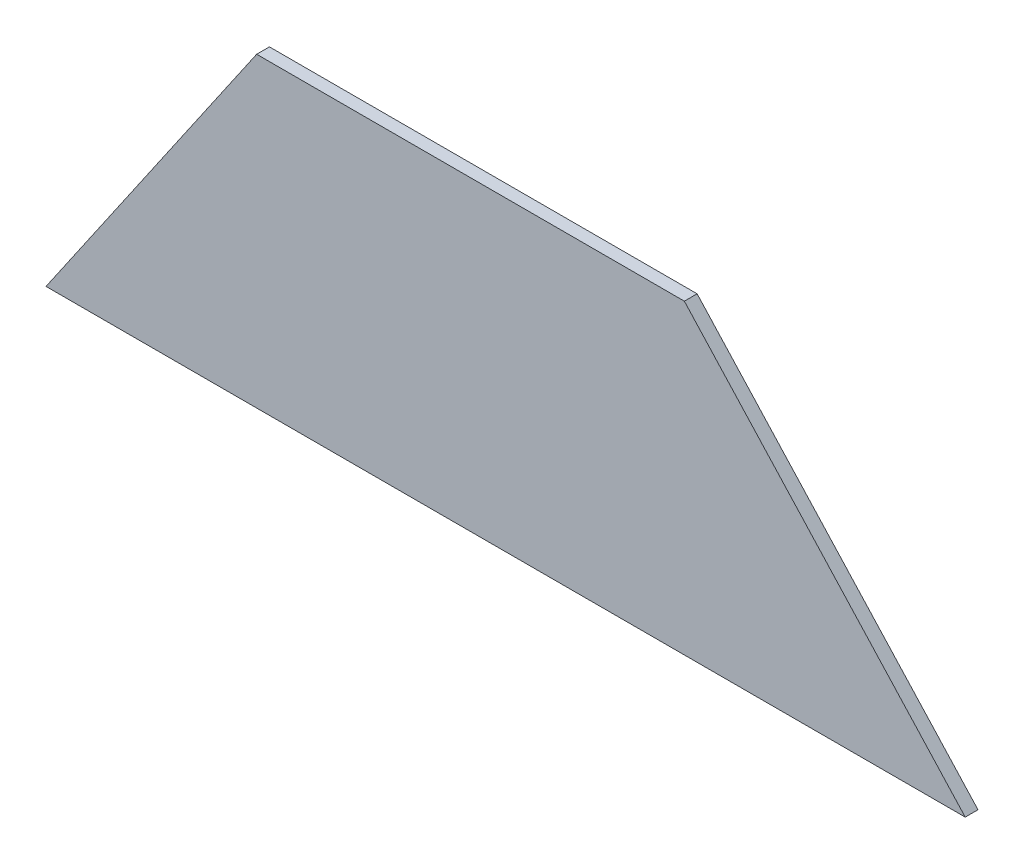
ISO-10303-21;
HEADER;
FILE_DESCRIPTION(('STEP AP214'),'2;1');
FILE_NAME('part.step','',(''),(''),'','','');
FILE_SCHEMA(('AUTOMOTIVE_DESIGN { 1 0 10303 214 1 1 1 1 }'));
ENDSEC;
DATA;
#1=APPLICATION_CONTEXT('core data for automotive mechanical design processes');
#2=APPLICATION_PROTOCOL_DEFINITION('international standard','automotive_design',2000,#1);
#3=PRODUCT_CONTEXT('',#1,'mechanical');
#4=PRODUCT('Part','Part','',(#3));
#5=PRODUCT_RELATED_PRODUCT_CATEGORY('part','',(#4));
#6=PRODUCT_DEFINITION_FORMATION('','',#4);
#7=PRODUCT_DEFINITION_CONTEXT('part definition',#1,'design');
#8=PRODUCT_DEFINITION('design','',#6,#7);
#9=PRODUCT_DEFINITION_SHAPE('','',#8);
#10=(LENGTH_UNIT() NAMED_UNIT(*) SI_UNIT(.MILLI.,.METRE.));
#11=(NAMED_UNIT(*) PLANE_ANGLE_UNIT() SI_UNIT($,.RADIAN.));
#12=(NAMED_UNIT(*) SI_UNIT($,.STERADIAN.) SOLID_ANGLE_UNIT());
#13=UNCERTAINTY_MEASURE_WITH_UNIT(LENGTH_MEASURE(1.E-05),#10,'distance_accuracy_value','');
#14=(GEOMETRIC_REPRESENTATION_CONTEXT(3) GLOBAL_UNCERTAINTY_ASSIGNED_CONTEXT((#13)) GLOBAL_UNIT_ASSIGNED_CONTEXT((#10,
#11,#12)) REPRESENTATION_CONTEXT('',''));
#15=CARTESIAN_POINT('',(0.,0.,0.));
#16=DIRECTION('',(0.,0.,1.));
#17=DIRECTION('',(1.,0.,0.));
#18=AXIS2_PLACEMENT_3D('',#15,#16,#17);
#19=CARTESIAN_POINT('',(26.19375,38.1,1.5875));
#20=DIRECTION('',(0.824041924199368,-0.566528822887065,0.));
#21=DIRECTION('',(0.566528822887065,0.824041924199368,0.));
#22=AXIS2_PLACEMENT_3D('',#19,#20,#21);
#23=PLANE('',#22);
#24=DIRECTION('',(-0.566528822887065,-0.824041924199368,0.));
#25=VECTOR('',#24,1.);
#26=CARTESIAN_POINT('',(26.19375,38.1,0.));
#27=LINE('',#26,#25);
#28=CARTESIAN_POINT('',(26.19375,38.1,0.));
#29=VERTEX_POINT('',#28);
#30=CARTESIAN_POINT('',(0.,0.,0.));
#31=VERTEX_POINT('',#30);
#32=EDGE_CURVE('E97',#29,#31,#27,.T.);
#33=ORIENTED_EDGE('',*,*,#32,.T.);
#34=DIRECTION('',(0.,0.,-1.));
#35=VECTOR('',#34,1.);
#36=CARTESIAN_POINT('',(0.,0.,1.5875));
#37=LINE('',#36,#35);
#38=CARTESIAN_POINT('',(0.,0.,1.5875));
#39=VERTEX_POINT('',#38);
#40=EDGE_CURVE('E11',#39,#31,#37,.T.);
#41=ORIENTED_EDGE('',*,*,#40,.F.);
#42=DIRECTION('',(-0.566528822887065,-0.824041924199368,0.));
#43=VECTOR('',#42,1.);
#44=CARTESIAN_POINT('',(26.19375,38.1,1.5875));
#45=LINE('',#44,#43);
#46=CARTESIAN_POINT('',(26.19375,38.1,1.5875));
#47=VERTEX_POINT('',#46);
#48=EDGE_CURVE('E85',#47,#39,#45,.T.);
#49=ORIENTED_EDGE('',*,*,#48,.F.);
#50=DIRECTION('',(0.,0.,-1.));
#51=VECTOR('',#50,1.);
#52=CARTESIAN_POINT('',(26.19375,38.1,1.5875));
#53=LINE('',#52,#51);
#54=EDGE_CURVE('E93',#47,#29,#53,.T.);
#55=ORIENTED_EDGE('',*,*,#54,.T.);
#56=EDGE_LOOP('',(#33,#41,#49,#55));
#57=FACE_BOUND('',#56,.T.);
#58=ADVANCED_FACE('F34',(#57),#23,.F.);
#59=CARTESIAN_POINT('',(0.,0.,1.5875));
#60=DIRECTION('',(0.,1.,0.));
#61=DIRECTION('',(0.,0.,1.));
#62=AXIS2_PLACEMENT_3D('',#59,#60,#61);
#63=PLANE('',#62);
#64=DIRECTION('',(1.,0.,0.));
#65=VECTOR('',#64,1.);
#66=CARTESIAN_POINT('',(0.,0.,0.));
#67=LINE('',#66,#65);
#68=CARTESIAN_POINT('',(114.3,0.,0.));
#69=VERTEX_POINT('',#68);
#70=EDGE_CURVE('E89',#31,#69,#67,.T.);
#71=ORIENTED_EDGE('',*,*,#70,.T.);
#72=DIRECTION('',(0.,0.,-1.));
#73=VECTOR('',#72,1.);
#74=CARTESIAN_POINT('',(114.3,0.,1.5875));
#75=LINE('',#74,#73);
#76=CARTESIAN_POINT('',(114.3,0.,1.5875));
#77=VERTEX_POINT('',#76);
#78=EDGE_CURVE('E42',#77,#69,#75,.T.);
#79=ORIENTED_EDGE('',*,*,#78,.F.);
#80=DIRECTION('',(1.,0.,0.));
#81=VECTOR('',#80,1.);
#82=CARTESIAN_POINT('',(0.,0.,1.5875));
#83=LINE('',#82,#81);
#84=EDGE_CURVE('E80',#39,#77,#83,.T.);
#85=ORIENTED_EDGE('',*,*,#84,.F.);
#86=ORIENTED_EDGE('',*,*,#40,.T.);
#87=EDGE_LOOP('',(#71,#79,#85,#86));
#88=FACE_BOUND('',#87,.T.);
#89=ADVANCED_FACE('F88',(#88),#63,.F.);
#90=CARTESIAN_POINT('',(114.3,0.,1.5875));
#91=DIRECTION('',(-0.737154140200741,-0.675724628517346,0.));
#92=DIRECTION('',(0.675724628517346,-0.737154140200741,0.));
#93=AXIS2_PLACEMENT_3D('',#90,#91,#92);
#94=PLANE('',#93);
#95=DIRECTION('',(-0.675724628517346,0.737154140200741,0.));
#96=VECTOR('',#95,1.);
#97=CARTESIAN_POINT('',(114.3,0.,0.));
#98=LINE('',#97,#96);
#99=CARTESIAN_POINT('',(79.375,38.1,0.));
#100=VERTEX_POINT('',#99);
#101=EDGE_CURVE('E67',#69,#100,#98,.T.);
#102=ORIENTED_EDGE('',*,*,#101,.T.);
#103=DIRECTION('',(0.,0.,-1.));
#104=VECTOR('',#103,1.);
#105=CARTESIAN_POINT('',(79.375,38.1,1.5875));
#106=LINE('',#105,#104);
#107=CARTESIAN_POINT('',(79.375,38.1,1.5875));
#108=VERTEX_POINT('',#107);
#109=EDGE_CURVE('E90',#108,#100,#106,.T.);
#110=ORIENTED_EDGE('',*,*,#109,.F.);
#111=DIRECTION('',(-0.675724628517346,0.737154140200741,0.));
#112=VECTOR('',#111,1.);
#113=CARTESIAN_POINT('',(114.3,0.,1.5875));
#114=LINE('',#113,#112);
#115=EDGE_CURVE('E83',#77,#108,#114,.T.);
#116=ORIENTED_EDGE('',*,*,#115,.F.);
#117=ORIENTED_EDGE('',*,*,#78,.T.);
#118=EDGE_LOOP('',(#102,#110,#116,#117));
#119=FACE_BOUND('',#118,.T.);
#120=ADVANCED_FACE('F91',(#119),#94,.F.);
#121=CARTESIAN_POINT('',(79.375,38.1,1.5875));
#122=DIRECTION('',(0.,-1.,0.));
#123=DIRECTION('',(1.,0.,0.));
#124=AXIS2_PLACEMENT_3D('',#121,#122,#123);
#125=PLANE('',#124);
#126=DIRECTION('',(-1.,0.,0.));
#127=VECTOR('',#126,1.);
#128=CARTESIAN_POINT('',(79.375,38.1,0.));
#129=LINE('',#128,#127);
#130=EDGE_CURVE('E73',#100,#29,#129,.T.);
#131=ORIENTED_EDGE('',*,*,#130,.T.);
#132=ORIENTED_EDGE('',*,*,#54,.F.);
#133=DIRECTION('',(-1.,0.,0.));
#134=VECTOR('',#133,1.);
#135=CARTESIAN_POINT('',(79.375,38.1,1.5875));
#136=LINE('',#135,#134);
#137=EDGE_CURVE('E50',#108,#47,#136,.T.);
#138=ORIENTED_EDGE('',*,*,#137,.F.);
#139=ORIENTED_EDGE('',*,*,#109,.T.);
#140=EDGE_LOOP('',(#131,#132,#138,#139));
#141=FACE_BOUND('',#140,.T.);
#142=ADVANCED_FACE('F104',(#141),#125,.F.);
#143=CARTESIAN_POINT('',(0.,0.,1.5875));
#144=DIRECTION('',(0.,0.,-1.));
#145=DIRECTION('',(-1.,0.,0.));
#146=AXIS2_PLACEMENT_3D('',#143,#144,#145);
#147=PLANE('',#146);
#148=ORIENTED_EDGE('',*,*,#48,.T.);
#149=ORIENTED_EDGE('',*,*,#84,.T.);
#150=ORIENTED_EDGE('',*,*,#115,.T.);
#151=ORIENTED_EDGE('',*,*,#137,.T.);
#152=EDGE_LOOP('',(#148,#149,#150,#151));
#153=FACE_BOUND('',#152,.T.);
#154=ADVANCED_FACE('F81',(#153),#147,.F.);
#155=CARTESIAN_POINT('',(0.,0.,0.));
#156=DIRECTION('',(0.,0.,-1.));
#157=DIRECTION('',(-1.,0.,0.));
#158=AXIS2_PLACEMENT_3D('',#155,#156,#157);
#159=PLANE('',#158);
#160=ORIENTED_EDGE('',*,*,#32,.F.);
#161=ORIENTED_EDGE('',*,*,#130,.F.);
#162=ORIENTED_EDGE('',*,*,#101,.F.);
#163=ORIENTED_EDGE('',*,*,#70,.F.);
#164=EDGE_LOOP('',(#160,#161,#162,#163));
#165=FACE_BOUND('',#164,.T.);
#166=ADVANCED_FACE('F107',(#165),#159,.T.);
#167=CLOSED_SHELL('',(#58,#89,#120,#142,#154,#166));
#168=MANIFOLD_SOLID_BREP('B2',#167);
#169=ADVANCED_BREP_SHAPE_REPRESENTATION('',(#18,#168),#14);
#170=SHAPE_DEFINITION_REPRESENTATION(#9,#169);
ENDSEC;
END-ISO-10303-21;
